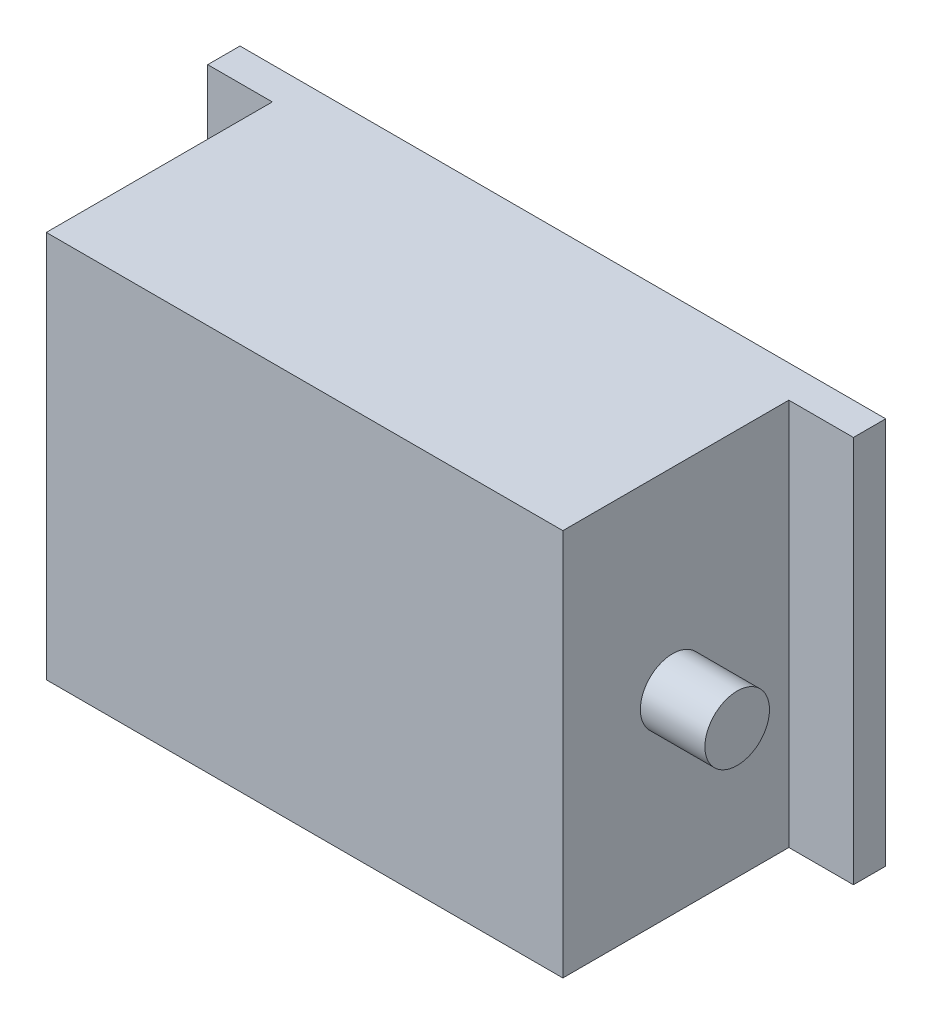
ISO-10303-21;
HEADER;
FILE_DESCRIPTION(('STEP AP214'),'2;1');
FILE_NAME('part.step','',(''),(''),'','','');
FILE_SCHEMA(('AUTOMOTIVE_DESIGN { 1 0 10303 214 1 1 1 1 }'));
ENDSEC;
DATA;
#1=APPLICATION_CONTEXT('core data for automotive mechanical design processes');
#2=APPLICATION_PROTOCOL_DEFINITION('international standard','automotive_design',2000,#1);
#3=PRODUCT_CONTEXT('',#1,'mechanical');
#4=PRODUCT('Part','Part','',(#3));
#5=PRODUCT_RELATED_PRODUCT_CATEGORY('part','',(#4));
#6=PRODUCT_DEFINITION_FORMATION('','',#4);
#7=PRODUCT_DEFINITION_CONTEXT('part definition',#1,'design');
#8=PRODUCT_DEFINITION('design','',#6,#7);
#9=PRODUCT_DEFINITION_SHAPE('','',#8);
#10=(LENGTH_UNIT() NAMED_UNIT(*) SI_UNIT(.MILLI.,.METRE.));
#11=(NAMED_UNIT(*) PLANE_ANGLE_UNIT() SI_UNIT($,.RADIAN.));
#12=(NAMED_UNIT(*) SI_UNIT($,.STERADIAN.) SOLID_ANGLE_UNIT());
#13=UNCERTAINTY_MEASURE_WITH_UNIT(LENGTH_MEASURE(1.E-05),#10,'distance_accuracy_value','');
#14=(GEOMETRIC_REPRESENTATION_CONTEXT(3) GLOBAL_UNCERTAINTY_ASSIGNED_CONTEXT((#13)) GLOBAL_UNIT_ASSIGNED_CONTEXT((#10,
#11,#12)) REPRESENTATION_CONTEXT('',''));
#15=CARTESIAN_POINT('',(0.,0.,0.));
#16=DIRECTION('',(0.,0.,1.));
#17=DIRECTION('',(1.,0.,0.));
#18=AXIS2_PLACEMENT_3D('',#15,#16,#17);
#19=CARTESIAN_POINT('',(89.9999999999999,60.,40.));
#20=DIRECTION('',(-1.,0.,0.));
#21=DIRECTION('',(0.,0.,1.));
#22=AXIS2_PLACEMENT_3D('',#19,#20,#21);
#23=PLANE('',#22);
#24=DIRECTION('',(0.,0.,-1.));
#25=VECTOR('',#24,1.);
#26=CARTESIAN_POINT('',(89.9999999999999,0.,40.));
#27=LINE('',#26,#25);
#28=CARTESIAN_POINT('',(89.9999999999999,0.,40.));
#29=VERTEX_POINT('',#28);
#30=CARTESIAN_POINT('',(89.9999999999999,0.,5.));
#31=VERTEX_POINT('',#30);
#32=EDGE_CURVE('E101',#29,#31,#27,.T.);
#33=ORIENTED_EDGE('',*,*,#32,.T.);
#34=DIRECTION('',(0.,-1.,0.));
#35=VECTOR('',#34,1.);
#36=CARTESIAN_POINT('',(89.9999999999999,60.,5.));
#37=LINE('',#36,#35);
#38=CARTESIAN_POINT('',(89.9999999999999,60.,5.));
#39=VERTEX_POINT('',#38);
#40=EDGE_CURVE('E97',#39,#31,#37,.T.);
#41=ORIENTED_EDGE('',*,*,#40,.F.);
#42=DIRECTION('',(0.,0.,-1.));
#43=VECTOR('',#42,1.);
#44=CARTESIAN_POINT('',(89.9999999999999,60.,40.));
#45=LINE('',#44,#43);
#46=CARTESIAN_POINT('',(89.9999999999999,60.,40.));
#47=VERTEX_POINT('',#46);
#48=EDGE_CURVE('E48',#47,#39,#45,.T.);
#49=ORIENTED_EDGE('',*,*,#48,.F.);
#50=DIRECTION('',(0.,-1.,0.));
#51=VECTOR('',#50,1.);
#52=CARTESIAN_POINT('',(89.9999999999999,60.,40.));
#53=LINE('',#52,#51);
#54=EDGE_CURVE('E105',#47,#29,#53,.T.);
#55=ORIENTED_EDGE('',*,*,#54,.T.);
#56=EDGE_LOOP('',(#33,#41,#49,#55));
#57=FACE_BOUND('',#56,.T.);
#58=CARTESIAN_POINT('',(89.9999999999999,30.,23.));
#59=DIRECTION('',(-1.,0.,0.));
#60=DIRECTION('',(0.,0.,1.));
#61=AXIS2_PLACEMENT_3D('',#58,#59,#60);
#62=CIRCLE('',#61,5.);
#63=CARTESIAN_POINT('',(89.9999999999999,30.,28.));
#64=VERTEX_POINT('',#63);
#65=EDGE_CURVE('E11',#64,#64,#62,.F.);
#66=ORIENTED_EDGE('',*,*,#65,.F.);
#67=EDGE_LOOP('',(#66));
#68=FACE_BOUND('',#67,.T.);
#69=ADVANCED_FACE('F33',(#57,#68),#23,.F.);
#70=CARTESIAN_POINT('',(0.,0.,40.));
#71=DIRECTION('',(1.,0.,0.));
#72=DIRECTION('',(0.,0.,-1.));
#73=AXIS2_PLACEMENT_3D('',#70,#71,#72);
#74=PLANE('',#73);
#75=DIRECTION('',(0.,0.,-1.));
#76=VECTOR('',#75,1.);
#77=CARTESIAN_POINT('',(0.,0.,40.));
#78=LINE('',#77,#76);
#79=CARTESIAN_POINT('',(0.,0.,5.));
#80=VERTEX_POINT('',#79);
#81=CARTESIAN_POINT('',(0.,0.,0.));
#82=VERTEX_POINT('',#81);
#83=EDGE_CURVE('E41',#80,#82,#78,.T.);
#84=ORIENTED_EDGE('',*,*,#83,.F.);
#85=DIRECTION('',(0.,-1.,0.));
#86=VECTOR('',#85,1.);
#87=CARTESIAN_POINT('',(0.,60.,5.));
#88=LINE('',#87,#86);
#89=CARTESIAN_POINT('',(0.,60.,5.));
#90=VERTEX_POINT('',#89);
#91=EDGE_CURVE('E135',#90,#80,#88,.T.);
#92=ORIENTED_EDGE('',*,*,#91,.F.);
#93=DIRECTION('',(0.,0.,-1.));
#94=VECTOR('',#93,1.);
#95=CARTESIAN_POINT('',(0.,60.,40.));
#96=LINE('',#95,#94);
#97=CARTESIAN_POINT('',(0.,60.,0.));
#98=VERTEX_POINT('',#97);
#99=EDGE_CURVE('E150',#90,#98,#96,.T.);
#100=ORIENTED_EDGE('',*,*,#99,.T.);
#101=DIRECTION('',(0.,-1.,0.));
#102=VECTOR('',#101,1.);
#103=CARTESIAN_POINT('',(0.,0.,0.));
#104=LINE('',#103,#102);
#105=EDGE_CURVE('E141',#98,#82,#104,.T.);
#106=ORIENTED_EDGE('',*,*,#105,.T.);
#107=EDGE_LOOP('',(#84,#92,#100,#106));
#108=FACE_BOUND('',#107,.T.);
#109=ADVANCED_FACE('F35',(#108),#74,.F.);
#110=CARTESIAN_POINT('',(0.,0.,40.));
#111=DIRECTION('',(0.,1.,0.));
#112=DIRECTION('',(0.,0.,1.));
#113=AXIS2_PLACEMENT_3D('',#110,#111,#112);
#114=PLANE('',#113);
#115=DIRECTION('',(0.,0.,-1.));
#116=VECTOR('',#115,1.);
#117=CARTESIAN_POINT('',(100.,0.,40.));
#118=LINE('',#117,#116);
#119=CARTESIAN_POINT('',(100.,0.,5.));
#120=VERTEX_POINT('',#119);
#121=CARTESIAN_POINT('',(100.,0.,0.));
#122=VERTEX_POINT('',#121);
#123=EDGE_CURVE('E164',#120,#122,#118,.T.);
#124=ORIENTED_EDGE('',*,*,#123,.F.);
#125=DIRECTION('',(1.,0.,0.));
#126=VECTOR('',#125,1.);
#127=CARTESIAN_POINT('',(100.,0.,5.));
#128=LINE('',#127,#126);
#129=EDGE_CURVE('E118',#31,#120,#128,.T.);
#130=ORIENTED_EDGE('',*,*,#129,.F.);
#131=ORIENTED_EDGE('',*,*,#32,.F.);
#132=DIRECTION('',(1.,0.,0.));
#133=VECTOR('',#132,1.);
#134=CARTESIAN_POINT('',(0.,0.,40.));
#135=LINE('',#134,#133);
#136=CARTESIAN_POINT('',(10.,0.,40.));
#137=VERTEX_POINT('',#136);
#138=EDGE_CURVE('E145',#137,#29,#135,.T.);
#139=ORIENTED_EDGE('',*,*,#138,.F.);
#140=DIRECTION('',(0.,0.,1.));
#141=VECTOR('',#140,1.);
#142=CARTESIAN_POINT('',(10.,0.,40.));
#143=LINE('',#142,#141);
#144=CARTESIAN_POINT('',(10.,0.,5.));
#145=VERTEX_POINT('',#144);
#146=EDGE_CURVE('E56',#145,#137,#143,.T.);
#147=ORIENTED_EDGE('',*,*,#146,.F.);
#148=DIRECTION('',(1.,0.,0.));
#149=VECTOR('',#148,1.);
#150=CARTESIAN_POINT('',(0.,0.,5.));
#151=LINE('',#150,#149);
#152=EDGE_CURVE('E127',#80,#145,#151,.T.);
#153=ORIENTED_EDGE('',*,*,#152,.F.);
#154=ORIENTED_EDGE('',*,*,#83,.T.);
#155=DIRECTION('',(1.,0.,0.));
#156=VECTOR('',#155,1.);
#157=CARTESIAN_POINT('',(0.,0.,0.));
#158=LINE('',#157,#156);
#159=EDGE_CURVE('E153',#82,#122,#158,.T.);
#160=ORIENTED_EDGE('',*,*,#159,.T.);
#161=EDGE_LOOP('',(#124,#130,#131,#139,#147,#153,#154,#160));
#162=FACE_BOUND('',#161,.T.);
#163=ADVANCED_FACE('F170',(#162),#114,.F.);
#164=CARTESIAN_POINT('',(100.,0.,40.));
#165=DIRECTION('',(-1.,0.,0.));
#166=DIRECTION('',(0.,0.,1.));
#167=AXIS2_PLACEMENT_3D('',#164,#165,#166);
#168=PLANE('',#167);
#169=DIRECTION('',(0.,0.,-1.));
#170=VECTOR('',#169,1.);
#171=CARTESIAN_POINT('',(100.,60.,40.));
#172=LINE('',#171,#170);
#173=CARTESIAN_POINT('',(100.,60.,5.));
#174=VERTEX_POINT('',#173);
#175=CARTESIAN_POINT('',(100.,60.,0.));
#176=VERTEX_POINT('',#175);
#177=EDGE_CURVE('E162',#174,#176,#172,.T.);
#178=ORIENTED_EDGE('',*,*,#177,.F.);
#179=DIRECTION('',(0.,-1.,0.));
#180=VECTOR('',#179,1.);
#181=CARTESIAN_POINT('',(100.,60.,5.));
#182=LINE('',#181,#180);
#183=EDGE_CURVE('E104',#174,#120,#182,.T.);
#184=ORIENTED_EDGE('',*,*,#183,.T.);
#185=ORIENTED_EDGE('',*,*,#123,.T.);
#186=DIRECTION('',(0.,1.,0.));
#187=VECTOR('',#186,1.);
#188=CARTESIAN_POINT('',(100.,0.,0.));
#189=LINE('',#188,#187);
#190=EDGE_CURVE('E156',#122,#176,#189,.T.);
#191=ORIENTED_EDGE('',*,*,#190,.T.);
#192=EDGE_LOOP('',(#178,#184,#185,#191));
#193=FACE_BOUND('',#192,.T.);
#194=ADVANCED_FACE('F180',(#193),#168,.F.);
#195=CARTESIAN_POINT('',(0.,60.,40.));
#196=DIRECTION('',(0.,-1.,0.));
#197=DIRECTION('',(0.,0.,-1.));
#198=AXIS2_PLACEMENT_3D('',#195,#196,#197);
#199=PLANE('',#198);
#200=ORIENTED_EDGE('',*,*,#48,.T.);
#201=DIRECTION('',(1.,0.,0.));
#202=VECTOR('',#201,1.);
#203=CARTESIAN_POINT('',(100.,60.,5.));
#204=LINE('',#203,#202);
#205=EDGE_CURVE('E108',#39,#174,#204,.T.);
#206=ORIENTED_EDGE('',*,*,#205,.T.);
#207=ORIENTED_EDGE('',*,*,#177,.T.);
#208=DIRECTION('',(-1.,0.,0.));
#209=VECTOR('',#208,1.);
#210=CARTESIAN_POINT('',(0.,60.,0.));
#211=LINE('',#210,#209);
#212=EDGE_CURVE('E148',#176,#98,#211,.T.);
#213=ORIENTED_EDGE('',*,*,#212,.T.);
#214=ORIENTED_EDGE('',*,*,#99,.F.);
#215=DIRECTION('',(1.,0.,0.));
#216=VECTOR('',#215,1.);
#217=CARTESIAN_POINT('',(0.,60.,5.));
#218=LINE('',#217,#216);
#219=CARTESIAN_POINT('',(10.,60.,5.));
#220=VERTEX_POINT('',#219);
#221=EDGE_CURVE('E130',#90,#220,#218,.T.);
#222=ORIENTED_EDGE('',*,*,#221,.T.);
#223=DIRECTION('',(0.,0.,1.));
#224=VECTOR('',#223,1.);
#225=CARTESIAN_POINT('',(10.,60.,40.));
#226=LINE('',#225,#224);
#227=CARTESIAN_POINT('',(10.,60.,40.));
#228=VERTEX_POINT('',#227);
#229=EDGE_CURVE('E133',#220,#228,#226,.T.);
#230=ORIENTED_EDGE('',*,*,#229,.T.);
#231=DIRECTION('',(-1.,0.,0.));
#232=VECTOR('',#231,1.);
#233=CARTESIAN_POINT('',(0.,60.,40.));
#234=LINE('',#233,#232);
#235=EDGE_CURVE('E117',#47,#228,#234,.T.);
#236=ORIENTED_EDGE('',*,*,#235,.F.);
#237=EDGE_LOOP('',(#200,#206,#207,#213,#214,#222,#230,#236));
#238=FACE_BOUND('',#237,.T.);
#239=ADVANCED_FACE('F115',(#238),#199,.F.);
#240=CARTESIAN_POINT('',(0.,0.,40.));
#241=DIRECTION('',(0.,0.,-1.));
#242=DIRECTION('',(-1.,0.,0.));
#243=AXIS2_PLACEMENT_3D('',#240,#241,#242);
#244=PLANE('',#243);
#245=ORIENTED_EDGE('',*,*,#138,.T.);
#246=ORIENTED_EDGE('',*,*,#54,.F.);
#247=ORIENTED_EDGE('',*,*,#235,.T.);
#248=DIRECTION('',(0.,-1.,0.));
#249=VECTOR('',#248,1.);
#250=CARTESIAN_POINT('',(10.,60.,40.));
#251=LINE('',#250,#249);
#252=EDGE_CURVE('E139',#228,#137,#251,.T.);
#253=ORIENTED_EDGE('',*,*,#252,.T.);
#254=EDGE_LOOP('',(#245,#246,#247,#253));
#255=FACE_BOUND('',#254,.T.);
#256=ADVANCED_FACE('F183',(#255),#244,.F.);
#257=CARTESIAN_POINT('',(0.,0.,0.));
#258=DIRECTION('',(0.,0.,-1.));
#259=DIRECTION('',(-1.,0.,0.));
#260=AXIS2_PLACEMENT_3D('',#257,#258,#259);
#261=PLANE('',#260);
#262=ORIENTED_EDGE('',*,*,#105,.F.);
#263=ORIENTED_EDGE('',*,*,#212,.F.);
#264=ORIENTED_EDGE('',*,*,#190,.F.);
#265=ORIENTED_EDGE('',*,*,#159,.F.);
#266=EDGE_LOOP('',(#262,#263,#264,#265));
#267=FACE_BOUND('',#266,.T.);
#268=ADVANCED_FACE('F176',(#267),#261,.T.);
#269=CARTESIAN_POINT('',(10.,60.,40.));
#270=DIRECTION('',(1.,0.,0.));
#271=DIRECTION('',(0.,0.,-1.));
#272=AXIS2_PLACEMENT_3D('',#269,#270,#271);
#273=PLANE('',#272);
#274=CARTESIAN_POINT('',(10.,30.,20.));
#275=DIRECTION('',(-1.,0.,0.));
#276=DIRECTION('',(0.,0.,1.));
#277=AXIS2_PLACEMENT_3D('',#274,#275,#276);
#278=CIRCLE('',#277,10.);
#279=CARTESIAN_POINT('',(10.,30.,30.));
#280=VERTEX_POINT('',#279);
#281=EDGE_CURVE('E122',#280,#280,#278,.T.);
#282=ORIENTED_EDGE('',*,*,#281,.F.);
#283=EDGE_LOOP('',(#282));
#284=FACE_BOUND('',#283,.T.);
#285=ORIENTED_EDGE('',*,*,#146,.T.);
#286=ORIENTED_EDGE('',*,*,#252,.F.);
#287=ORIENTED_EDGE('',*,*,#229,.F.);
#288=DIRECTION('',(0.,-1.,0.));
#289=VECTOR('',#288,1.);
#290=CARTESIAN_POINT('',(10.,60.,5.));
#291=LINE('',#290,#289);
#292=EDGE_CURVE('E142',#220,#145,#291,.T.);
#293=ORIENTED_EDGE('',*,*,#292,.T.);
#294=EDGE_LOOP('',(#285,#286,#287,#293));
#295=FACE_BOUND('',#294,.T.);
#296=ADVANCED_FACE('F185',(#284,#295),#273,.F.);
#297=CARTESIAN_POINT('',(0.,60.,5.));
#298=DIRECTION('',(0.,0.,-1.));
#299=DIRECTION('',(-1.,0.,0.));
#300=AXIS2_PLACEMENT_3D('',#297,#298,#299);
#301=PLANE('',#300);
#302=ORIENTED_EDGE('',*,*,#152,.T.);
#303=ORIENTED_EDGE('',*,*,#292,.F.);
#304=ORIENTED_EDGE('',*,*,#221,.F.);
#305=ORIENTED_EDGE('',*,*,#91,.T.);
#306=EDGE_LOOP('',(#302,#303,#304,#305));
#307=FACE_BOUND('',#306,.T.);
#308=ADVANCED_FACE('F187',(#307),#301,.F.);
#309=CARTESIAN_POINT('',(100.,60.,5.));
#310=DIRECTION('',(0.,0.,-1.));
#311=DIRECTION('',(-1.,0.,0.));
#312=AXIS2_PLACEMENT_3D('',#309,#310,#311);
#313=PLANE('',#312);
#314=ORIENTED_EDGE('',*,*,#129,.T.);
#315=ORIENTED_EDGE('',*,*,#183,.F.);
#316=ORIENTED_EDGE('',*,*,#205,.F.);
#317=ORIENTED_EDGE('',*,*,#40,.T.);
#318=EDGE_LOOP('',(#314,#315,#316,#317));
#319=FACE_BOUND('',#318,.T.);
#320=ADVANCED_FACE('F109',(#319),#313,.F.);
#321=CARTESIAN_POINT('',(20.,30.,20.));
#322=DIRECTION('',(-1.,0.,0.));
#323=DIRECTION('',(0.,0.,1.));
#324=AXIS2_PLACEMENT_3D('',#321,#322,#323);
#325=CYLINDRICAL_SURFACE('',#324,10.);
#326=CARTESIAN_POINT('',(20.,30.,20.));
#327=DIRECTION('',(-1.,0.,0.));
#328=DIRECTION('',(0.,0.,1.));
#329=AXIS2_PLACEMENT_3D('',#326,#327,#328);
#330=CIRCLE('',#329,10.);
#331=CARTESIAN_POINT('',(20.,30.,30.));
#332=VERTEX_POINT('',#331);
#333=EDGE_CURVE('E125',#332,#332,#330,.T.);
#334=ORIENTED_EDGE('',*,*,#333,.F.);
#335=EDGE_LOOP('',(#334));
#336=FACE_BOUND('',#335,.T.);
#337=ORIENTED_EDGE('',*,*,#281,.T.);
#338=EDGE_LOOP('',(#337));
#339=FACE_BOUND('',#338,.T.);
#340=ADVANCED_FACE('F194',(#336,#339),#325,.F.);
#341=CARTESIAN_POINT('',(20.,30.,20.));
#342=DIRECTION('',(-1.,0.,0.));
#343=DIRECTION('',(0.,0.,1.));
#344=AXIS2_PLACEMENT_3D('',#341,#342,#343);
#345=PLANE('',#344);
#346=ORIENTED_EDGE('',*,*,#333,.T.);
#347=EDGE_LOOP('',(#346));
#348=FACE_BOUND('',#347,.T.);
#349=ADVANCED_FACE('F207',(#348),#345,.T.);
#350=CARTESIAN_POINT('',(99.9999999999999,30.,23.));
#351=DIRECTION('',(-1.,0.,0.));
#352=DIRECTION('',(0.,0.,1.));
#353=AXIS2_PLACEMENT_3D('',#350,#351,#352);
#354=CYLINDRICAL_SURFACE('',#353,5.);
#355=CARTESIAN_POINT('',(99.9999999999999,30.,23.));
#356=DIRECTION('',(1.,0.,0.));
#357=DIRECTION('',(0.,0.,-1.));
#358=AXIS2_PLACEMENT_3D('',#355,#356,#357);
#359=CIRCLE('',#358,5.);
#360=CARTESIAN_POINT('',(99.9999999999999,30.,18.));
#361=VERTEX_POINT('',#360);
#362=EDGE_CURVE('E223',#361,#361,#359,.T.);
#363=ORIENTED_EDGE('',*,*,#362,.F.);
#364=EDGE_LOOP('',(#363));
#365=FACE_BOUND('',#364,.T.);
#366=ORIENTED_EDGE('',*,*,#65,.T.);
#367=EDGE_LOOP('',(#366));
#368=FACE_BOUND('',#367,.T.);
#369=ADVANCED_FACE('F211',(#365,#368),#354,.T.);
#370=CARTESIAN_POINT('',(99.9999999999999,30.,23.));
#371=DIRECTION('',(1.,0.,0.));
#372=DIRECTION('',(0.,0.,-1.));
#373=AXIS2_PLACEMENT_3D('',#370,#371,#372);
#374=PLANE('',#373);
#375=ORIENTED_EDGE('',*,*,#362,.T.);
#376=EDGE_LOOP('',(#375));
#377=FACE_BOUND('',#376,.T.);
#378=ADVANCED_FACE('F215',(#377),#374,.T.);
#379=CLOSED_SHELL('',(#69,#109,#163,#194,#239,#256,#268,#296,#308,#320,#340,#349,#369,#378));
#380=MANIFOLD_SOLID_BREP('B2',#379);
#381=ADVANCED_BREP_SHAPE_REPRESENTATION('',(#18,#380),#14);
#382=SHAPE_DEFINITION_REPRESENTATION(#9,#381);
ENDSEC;
END-ISO-10303-21;
